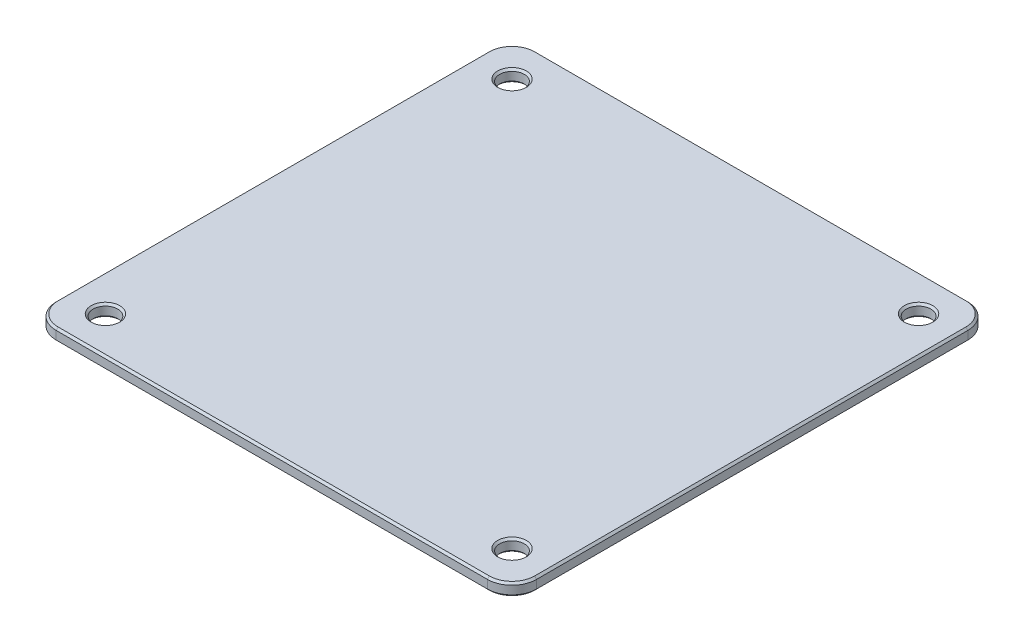
ISO-10303-21;
HEADER;
FILE_DESCRIPTION(('STEP AP214'),'2;1');
FILE_NAME('part.step','',(''),(''),'','','');
FILE_SCHEMA(('AUTOMOTIVE_DESIGN { 1 0 10303 214 1 1 1 1 }'));
ENDSEC;
DATA;
#1=APPLICATION_CONTEXT('core data for automotive mechanical design processes');
#2=APPLICATION_PROTOCOL_DEFINITION('international standard','automotive_design',2000,#1);
#3=PRODUCT_CONTEXT('',#1,'mechanical');
#4=PRODUCT('Part','Part','',(#3));
#5=PRODUCT_RELATED_PRODUCT_CATEGORY('part','',(#4));
#6=PRODUCT_DEFINITION_FORMATION('','',#4);
#7=PRODUCT_DEFINITION_CONTEXT('part definition',#1,'design');
#8=PRODUCT_DEFINITION('design','',#6,#7);
#9=PRODUCT_DEFINITION_SHAPE('','',#8);
#10=(LENGTH_UNIT() NAMED_UNIT(*) SI_UNIT(.MILLI.,.METRE.));
#11=(NAMED_UNIT(*) PLANE_ANGLE_UNIT() SI_UNIT($,.RADIAN.));
#12=(NAMED_UNIT(*) SI_UNIT($,.STERADIAN.) SOLID_ANGLE_UNIT());
#13=UNCERTAINTY_MEASURE_WITH_UNIT(LENGTH_MEASURE(1.E-05),#10,'distance_accuracy_value','');
#14=(GEOMETRIC_REPRESENTATION_CONTEXT(3) GLOBAL_UNCERTAINTY_ASSIGNED_CONTEXT((#13)) GLOBAL_UNIT_ASSIGNED_CONTEXT((#10,
#11,#12)) REPRESENTATION_CONTEXT('',''));
#15=CARTESIAN_POINT('',(0.,0.,0.));
#16=DIRECTION('',(0.,0.,1.));
#17=DIRECTION('',(1.,0.,0.));
#18=AXIS2_PLACEMENT_3D('',#15,#16,#17);
#19=CARTESIAN_POINT('',(0.,1.5875,0.));
#20=DIRECTION('',(0.,-1.,0.));
#21=DIRECTION('',(0.,0.,-1.));
#22=AXIS2_PLACEMENT_3D('',#19,#20,#21);
#23=PLANE('',#22);
#24=CARTESIAN_POINT('',(-26.19375,1.5875,26.19375));
#25=DIRECTION('',(0.,-1.,0.));
#26=DIRECTION('',(0.,0.,-1.));
#27=AXIS2_PLACEMENT_3D('',#24,#25,#26);
#28=CIRCLE('',#27,1.84149999999998);
#29=CARTESIAN_POINT('',(-26.19375,1.5875,24.35225));
#30=VERTEX_POINT('',#29);
#31=EDGE_CURVE('E11',#30,#30,#28,.T.);
#32=ORIENTED_EDGE('',*,*,#31,.T.);
#33=EDGE_LOOP('',(#32));
#34=FACE_BOUND('',#33,.T.);
#35=CARTESIAN_POINT('',(26.19375,1.5875,26.19375));
#36=DIRECTION('',(0.,-1.,0.));
#37=DIRECTION('',(0.,0.,-1.));
#38=AXIS2_PLACEMENT_3D('',#35,#36,#37);
#39=CIRCLE('',#38,1.84149999999998);
#40=CARTESIAN_POINT('',(26.19375,1.5875,24.35225));
#41=VERTEX_POINT('',#40);
#42=EDGE_CURVE('E41',#41,#41,#39,.T.);
#43=ORIENTED_EDGE('',*,*,#42,.T.);
#44=EDGE_LOOP('',(#43));
#45=FACE_BOUND('',#44,.T.);
#46=CARTESIAN_POINT('',(26.19375,1.5875,-26.19375));
#47=DIRECTION('',(0.,-1.,0.));
#48=DIRECTION('',(0.,0.,-1.));
#49=AXIS2_PLACEMENT_3D('',#46,#47,#48);
#50=CIRCLE('',#49,1.84150000000001);
#51=CARTESIAN_POINT('',(26.19375,1.5875,-28.03525));
#52=VERTEX_POINT('',#51);
#53=EDGE_CURVE('E258',#52,#52,#50,.T.);
#54=ORIENTED_EDGE('',*,*,#53,.T.);
#55=EDGE_LOOP('',(#54));
#56=FACE_BOUND('',#55,.T.);
#57=CARTESIAN_POINT('',(-26.19375,1.5875,-26.19375));
#58=DIRECTION('',(0.,-1.,0.));
#59=DIRECTION('',(0.,0.,-1.));
#60=AXIS2_PLACEMENT_3D('',#57,#58,#59);
#61=CIRCLE('',#60,1.84149999999998);
#62=CARTESIAN_POINT('',(-26.19375,1.5875,-28.03525));
#63=VERTEX_POINT('',#62);
#64=EDGE_CURVE('E255',#63,#63,#61,.T.);
#65=ORIENTED_EDGE('',*,*,#64,.T.);
#66=EDGE_LOOP('',(#65));
#67=FACE_BOUND('',#66,.T.);
#68=DIRECTION('',(0.,0.,1.));
#69=VECTOR('',#68,1.);
#70=CARTESIAN_POINT('',(-30.70225,1.5875,0.));
#71=LINE('',#70,#69);
#72=CARTESIAN_POINT('',(-30.70225,1.5875,-27.78125));
#73=VERTEX_POINT('',#72);
#74=CARTESIAN_POINT('',(-30.70225,1.5875,27.78125));
#75=VERTEX_POINT('',#74);
#76=EDGE_CURVE('E49',#73,#75,#71,.T.);
#77=ORIENTED_EDGE('',*,*,#76,.T.);
#78=CARTESIAN_POINT('',(-27.78125,1.5875,27.78125));
#79=DIRECTION('',(0.,-1.,0.));
#80=DIRECTION('',(0.,0.,-1.));
#81=AXIS2_PLACEMENT_3D('',#78,#79,#80);
#82=CIRCLE('',#81,2.92100000000001);
#83=CARTESIAN_POINT('',(-27.78125,1.5875,30.70225));
#84=VERTEX_POINT('',#83);
#85=EDGE_CURVE('E253',#75,#84,#82,.F.);
#86=ORIENTED_EDGE('',*,*,#85,.T.);
#87=DIRECTION('',(1.,0.,0.));
#88=VECTOR('',#87,1.);
#89=CARTESIAN_POINT('',(0.,1.5875,30.70225));
#90=LINE('',#89,#88);
#91=CARTESIAN_POINT('',(27.78125,1.5875,30.70225));
#92=VERTEX_POINT('',#91);
#93=EDGE_CURVE('E241',#84,#92,#90,.T.);
#94=ORIENTED_EDGE('',*,*,#93,.T.);
#95=CARTESIAN_POINT('',(27.78125,1.5875,27.78125));
#96=DIRECTION('',(0.,-1.,0.));
#97=DIRECTION('',(0.,0.,-1.));
#98=AXIS2_PLACEMENT_3D('',#95,#96,#97);
#99=CIRCLE('',#98,2.92100000000001);
#100=CARTESIAN_POINT('',(30.70225,1.5875,27.78125));
#101=VERTEX_POINT('',#100);
#102=EDGE_CURVE('E243',#92,#101,#99,.F.);
#103=ORIENTED_EDGE('',*,*,#102,.T.);
#104=DIRECTION('',(0.,0.,-1.));
#105=VECTOR('',#104,1.);
#106=CARTESIAN_POINT('',(30.70225,1.5875,0.));
#107=LINE('',#106,#105);
#108=CARTESIAN_POINT('',(30.70225,1.5875,-27.78125));
#109=VERTEX_POINT('',#108);
#110=EDGE_CURVE('E245',#101,#109,#107,.T.);
#111=ORIENTED_EDGE('',*,*,#110,.T.);
#112=CARTESIAN_POINT('',(27.78125,1.5875,-27.78125));
#113=DIRECTION('',(0.,-1.,0.));
#114=DIRECTION('',(0.,0.,-1.));
#115=AXIS2_PLACEMENT_3D('',#112,#113,#114);
#116=CIRCLE('',#115,2.92100000000001);
#117=CARTESIAN_POINT('',(27.78125,1.5875,-30.70225));
#118=VERTEX_POINT('',#117);
#119=EDGE_CURVE('E247',#109,#118,#116,.F.);
#120=ORIENTED_EDGE('',*,*,#119,.T.);
#121=DIRECTION('',(-1.,0.,0.));
#122=VECTOR('',#121,1.);
#123=CARTESIAN_POINT('',(0.,1.5875,-30.70225));
#124=LINE('',#123,#122);
#125=CARTESIAN_POINT('',(-27.78125,1.5875,-30.70225));
#126=VERTEX_POINT('',#125);
#127=EDGE_CURVE('E249',#118,#126,#124,.T.);
#128=ORIENTED_EDGE('',*,*,#127,.T.);
#129=CARTESIAN_POINT('',(-27.78125,1.5875,-27.78125));
#130=DIRECTION('',(0.,-1.,0.));
#131=DIRECTION('',(0.,0.,-1.));
#132=AXIS2_PLACEMENT_3D('',#129,#130,#131);
#133=CIRCLE('',#132,2.92100000000001);
#134=EDGE_CURVE('E54',#126,#73,#133,.F.);
#135=ORIENTED_EDGE('',*,*,#134,.T.);
#136=EDGE_LOOP('',(#77,#86,#94,#103,#111,#120,#128,#135));
#137=FACE_BOUND('',#136,.T.);
#138=ADVANCED_FACE('F32',(#34,#45,#56,#67,#137),#23,.F.);
#139=CARTESIAN_POINT('',(0.,0.,0.));
#140=DIRECTION('',(0.,-1.,0.));
#141=DIRECTION('',(0.,0.,-1.));
#142=AXIS2_PLACEMENT_3D('',#139,#140,#141);
#143=PLANE('',#142);
#144=CARTESIAN_POINT('',(-26.19375,0.,26.19375));
#145=DIRECTION('',(0.,-1.,0.));
#146=DIRECTION('',(0.,0.,-1.));
#147=AXIS2_PLACEMENT_3D('',#144,#145,#146);
#148=CIRCLE('',#147,1.8415);
#149=CARTESIAN_POINT('',(-26.19375,0.,24.35225));
#150=VERTEX_POINT('',#149);
#151=EDGE_CURVE('E177',#150,#150,#148,.F.);
#152=ORIENTED_EDGE('',*,*,#151,.T.);
#153=EDGE_LOOP('',(#152));
#154=FACE_BOUND('',#153,.T.);
#155=CARTESIAN_POINT('',(26.19375,0.,-26.19375));
#156=DIRECTION('',(0.,-1.,0.));
#157=DIRECTION('',(0.,0.,-1.));
#158=AXIS2_PLACEMENT_3D('',#155,#156,#157);
#159=CIRCLE('',#158,1.8415);
#160=CARTESIAN_POINT('',(26.19375,0.,-28.03525));
#161=VERTEX_POINT('',#160);
#162=EDGE_CURVE('E174',#161,#161,#159,.F.);
#163=ORIENTED_EDGE('',*,*,#162,.T.);
#164=EDGE_LOOP('',(#163));
#165=FACE_BOUND('',#164,.T.);
#166=DIRECTION('',(1.,0.,0.));
#167=VECTOR('',#166,1.);
#168=CARTESIAN_POINT('',(27.78125,0.,-30.70225));
#169=LINE('',#168,#167);
#170=CARTESIAN_POINT('',(-27.78125,0.,-30.70225));
#171=VERTEX_POINT('',#170);
#172=CARTESIAN_POINT('',(27.78125,0.,-30.70225));
#173=VERTEX_POINT('',#172);
#174=EDGE_CURVE('E172',#171,#173,#169,.T.);
#175=ORIENTED_EDGE('',*,*,#174,.T.);
#176=CARTESIAN_POINT('',(27.78125,0.,-27.78125));
#177=DIRECTION('',(0.,-1.,0.));
#178=DIRECTION('',(0.,0.,-1.));
#179=AXIS2_PLACEMENT_3D('',#176,#177,#178);
#180=CIRCLE('',#179,2.921);
#181=CARTESIAN_POINT('',(30.70225,0.,-27.78125));
#182=VERTEX_POINT('',#181);
#183=EDGE_CURVE('E152',#173,#182,#180,.T.);
#184=ORIENTED_EDGE('',*,*,#183,.T.);
#185=DIRECTION('',(0.,0.,1.));
#186=VECTOR('',#185,1.);
#187=CARTESIAN_POINT('',(30.70225,0.,27.78125));
#188=LINE('',#187,#186);
#189=CARTESIAN_POINT('',(30.70225,0.,27.78125));
#190=VERTEX_POINT('',#189);
#191=EDGE_CURVE('E160',#182,#190,#188,.T.);
#192=ORIENTED_EDGE('',*,*,#191,.T.);
#193=CARTESIAN_POINT('',(27.78125,0.,27.78125));
#194=DIRECTION('',(0.,-1.,0.));
#195=DIRECTION('',(0.,0.,-1.));
#196=AXIS2_PLACEMENT_3D('',#193,#194,#195);
#197=CIRCLE('',#196,2.921);
#198=CARTESIAN_POINT('',(27.78125,0.,30.70225));
#199=VERTEX_POINT('',#198);
#200=EDGE_CURVE('E166',#190,#199,#197,.T.);
#201=ORIENTED_EDGE('',*,*,#200,.T.);
#202=DIRECTION('',(-1.,0.,0.));
#203=VECTOR('',#202,1.);
#204=CARTESIAN_POINT('',(-27.78125,0.,30.70225));
#205=LINE('',#204,#203);
#206=CARTESIAN_POINT('',(-27.78125,0.,30.70225));
#207=VERTEX_POINT('',#206);
#208=EDGE_CURVE('E349',#199,#207,#205,.T.);
#209=ORIENTED_EDGE('',*,*,#208,.T.);
#210=CARTESIAN_POINT('',(-27.78125,0.,27.78125));
#211=DIRECTION('',(0.,-1.,0.));
#212=DIRECTION('',(0.,0.,-1.));
#213=AXIS2_PLACEMENT_3D('',#210,#211,#212);
#214=CIRCLE('',#213,2.921);
#215=CARTESIAN_POINT('',(-30.70225,0.,27.78125));
#216=VERTEX_POINT('',#215);
#217=EDGE_CURVE('E351',#207,#216,#214,.T.);
#218=ORIENTED_EDGE('',*,*,#217,.T.);
#219=DIRECTION('',(0.,0.,-1.));
#220=VECTOR('',#219,1.);
#221=CARTESIAN_POINT('',(-30.70225,0.,-27.78125));
#222=LINE('',#221,#220);
#223=CARTESIAN_POINT('',(-30.70225,0.,-27.78125));
#224=VERTEX_POINT('',#223);
#225=EDGE_CURVE('E353',#216,#224,#222,.T.);
#226=ORIENTED_EDGE('',*,*,#225,.T.);
#227=CARTESIAN_POINT('',(-27.78125,0.,-27.78125));
#228=DIRECTION('',(0.,-1.,0.));
#229=DIRECTION('',(0.,0.,-1.));
#230=AXIS2_PLACEMENT_3D('',#227,#228,#229);
#231=CIRCLE('',#230,2.921);
#232=EDGE_CURVE('E179',#224,#171,#231,.T.);
#233=ORIENTED_EDGE('',*,*,#232,.T.);
#234=EDGE_LOOP('',(#175,#184,#192,#201,#209,#218,#226,#233));
#235=FACE_BOUND('',#234,.T.);
#236=CARTESIAN_POINT('',(-26.19375,0.,-26.19375));
#237=DIRECTION('',(0.,-1.,0.));
#238=DIRECTION('',(0.,0.,-1.));
#239=AXIS2_PLACEMENT_3D('',#236,#237,#238);
#240=CIRCLE('',#239,1.84149999999998);
#241=CARTESIAN_POINT('',(-26.19375,0.,-28.03525));
#242=VERTEX_POINT('',#241);
#243=EDGE_CURVE('E167',#242,#242,#240,.F.);
#244=ORIENTED_EDGE('',*,*,#243,.T.);
#245=EDGE_LOOP('',(#244));
#246=FACE_BOUND('',#245,.T.);
#247=CARTESIAN_POINT('',(26.19375,0.,26.19375));
#248=DIRECTION('',(0.,-1.,0.));
#249=DIRECTION('',(0.,0.,-1.));
#250=AXIS2_PLACEMENT_3D('',#247,#248,#249);
#251=CIRCLE('',#250,1.8415);
#252=CARTESIAN_POINT('',(26.19375,0.,24.35225));
#253=VERTEX_POINT('',#252);
#254=EDGE_CURVE('E343',#253,#253,#251,.F.);
#255=ORIENTED_EDGE('',*,*,#254,.T.);
#256=EDGE_LOOP('',(#255));
#257=FACE_BOUND('',#256,.T.);
#258=ADVANCED_FACE('F169',(#154,#165,#235,#246,#257),#143,.T.);
#259=CARTESIAN_POINT('',(30.95625,1.5875,30.95625));
#260=DIRECTION('',(-1.,0.,0.));
#261=DIRECTION('',(0.,0.,1.));
#262=AXIS2_PLACEMENT_3D('',#259,#260,#261);
#263=PLANE('',#262);
#264=DIRECTION('',(0.,-1.,0.));
#265=VECTOR('',#264,1.);
#266=CARTESIAN_POINT('',(30.95625,1.5875,27.78125));
#267=LINE('',#266,#265);
#268=CARTESIAN_POINT('',(30.95625,1.33350000000001,27.78125));
#269=VERTEX_POINT('',#268);
#270=CARTESIAN_POINT('',(30.95625,0.254000000000004,27.78125));
#271=VERTEX_POINT('',#270);
#272=EDGE_CURVE('E323',#269,#271,#267,.T.);
#273=ORIENTED_EDGE('',*,*,#272,.T.);
#274=DIRECTION('',(0.,0.,-1.));
#275=VECTOR('',#274,1.);
#276=CARTESIAN_POINT('',(30.95625,0.254000000000004,-27.78125));
#277=LINE('',#276,#275);
#278=CARTESIAN_POINT('',(30.95625,0.254000000000004,-27.78125));
#279=VERTEX_POINT('',#278);
#280=EDGE_CURVE('E227',#271,#279,#277,.T.);
#281=ORIENTED_EDGE('',*,*,#280,.T.);
#282=DIRECTION('',(0.,-1.,0.));
#283=VECTOR('',#282,1.);
#284=CARTESIAN_POINT('',(30.95625,1.5875,-27.78125));
#285=LINE('',#284,#283);
#286=CARTESIAN_POINT('',(30.95625,1.33350000000001,-27.78125));
#287=VERTEX_POINT('',#286);
#288=EDGE_CURVE('E280',#279,#287,#285,.F.);
#289=ORIENTED_EDGE('',*,*,#288,.T.);
#290=DIRECTION('',(0.,0.,1.));
#291=VECTOR('',#290,1.);
#292=CARTESIAN_POINT('',(30.95625,1.33350000000001,30.95625));
#293=LINE('',#292,#291);
#294=EDGE_CURVE('E225',#287,#269,#293,.T.);
#295=ORIENTED_EDGE('',*,*,#294,.T.);
#296=EDGE_LOOP('',(#273,#281,#289,#295));
#297=FACE_BOUND('',#296,.T.);
#298=ADVANCED_FACE('F321',(#297),#263,.F.);
#299=CARTESIAN_POINT('',(-30.95625,1.5875,-30.95625));
#300=DIRECTION('',(0.,0.,1.));
#301=DIRECTION('',(1.,0.,0.));
#302=AXIS2_PLACEMENT_3D('',#299,#300,#301);
#303=PLANE('',#302);
#304=DIRECTION('',(0.,-1.,0.));
#305=VECTOR('',#304,1.);
#306=CARTESIAN_POINT('',(27.78125,1.5875,-30.95625));
#307=LINE('',#306,#305);
#308=CARTESIAN_POINT('',(27.78125,1.33350000000001,-30.95625));
#309=VERTEX_POINT('',#308);
#310=CARTESIAN_POINT('',(27.78125,0.254000000000004,-30.95625));
#311=VERTEX_POINT('',#310);
#312=EDGE_CURVE('E318',#309,#311,#307,.T.);
#313=ORIENTED_EDGE('',*,*,#312,.T.);
#314=DIRECTION('',(-1.,0.,0.));
#315=VECTOR('',#314,1.);
#316=CARTESIAN_POINT('',(-27.78125,0.254000000000004,-30.95625));
#317=LINE('',#316,#315);
#318=CARTESIAN_POINT('',(-27.78125,0.254000000000004,-30.95625));
#319=VERTEX_POINT('',#318);
#320=EDGE_CURVE('E202',#311,#319,#317,.T.);
#321=ORIENTED_EDGE('',*,*,#320,.T.);
#322=DIRECTION('',(0.,-1.,0.));
#323=VECTOR('',#322,1.);
#324=CARTESIAN_POINT('',(-27.78125,1.5875,-30.95625));
#325=LINE('',#324,#323);
#326=CARTESIAN_POINT('',(-27.78125,1.33350000000001,-30.95625));
#327=VERTEX_POINT('',#326);
#328=EDGE_CURVE('E340',#319,#327,#325,.F.);
#329=ORIENTED_EDGE('',*,*,#328,.T.);
#330=DIRECTION('',(1.,0.,0.));
#331=VECTOR('',#330,1.);
#332=CARTESIAN_POINT('',(-30.95625,1.33350000000001,-30.95625));
#333=LINE('',#332,#331);
#334=EDGE_CURVE('E200',#327,#309,#333,.T.);
#335=ORIENTED_EDGE('',*,*,#334,.T.);
#336=EDGE_LOOP('',(#313,#321,#329,#335));
#337=FACE_BOUND('',#336,.T.);
#338=ADVANCED_FACE('F366',(#337),#303,.F.);
#339=CARTESIAN_POINT('',(-30.95625,1.5875,30.95625));
#340=DIRECTION('',(1.,0.,0.));
#341=DIRECTION('',(0.,0.,-1.));
#342=AXIS2_PLACEMENT_3D('',#339,#340,#341);
#343=PLANE('',#342);
#344=DIRECTION('',(0.,-1.,0.));
#345=VECTOR('',#344,1.);
#346=CARTESIAN_POINT('',(-30.95625,1.5875,-27.78125));
#347=LINE('',#346,#345);
#348=CARTESIAN_POINT('',(-30.95625,1.33350000000001,-27.78125));
#349=VERTEX_POINT('',#348);
#350=CARTESIAN_POINT('',(-30.95625,0.254000000000004,-27.78125));
#351=VERTEX_POINT('',#350);
#352=EDGE_CURVE('E336',#349,#351,#347,.T.);
#353=ORIENTED_EDGE('',*,*,#352,.T.);
#354=DIRECTION('',(0.,0.,1.));
#355=VECTOR('',#354,1.);
#356=CARTESIAN_POINT('',(-30.95625,0.254000000000004,27.78125));
#357=LINE('',#356,#355);
#358=CARTESIAN_POINT('',(-30.95625,0.254000000000004,27.78125));
#359=VERTEX_POINT('',#358);
#360=EDGE_CURVE('E210',#351,#359,#357,.T.);
#361=ORIENTED_EDGE('',*,*,#360,.T.);
#362=DIRECTION('',(0.,-1.,0.));
#363=VECTOR('',#362,1.);
#364=CARTESIAN_POINT('',(-30.95625,1.5875,27.78125));
#365=LINE('',#364,#363);
#366=CARTESIAN_POINT('',(-30.95625,1.33350000000001,27.78125));
#367=VERTEX_POINT('',#366);
#368=EDGE_CURVE('E333',#359,#367,#365,.F.);
#369=ORIENTED_EDGE('',*,*,#368,.T.);
#370=DIRECTION('',(0.,0.,-1.));
#371=VECTOR('',#370,1.);
#372=CARTESIAN_POINT('',(-30.95625,1.33350000000001,30.95625));
#373=LINE('',#372,#371);
#374=EDGE_CURVE('E208',#367,#349,#373,.T.);
#375=ORIENTED_EDGE('',*,*,#374,.T.);
#376=EDGE_LOOP('',(#353,#361,#369,#375));
#377=FACE_BOUND('',#376,.T.);
#378=ADVANCED_FACE('F409',(#377),#343,.F.);
#379=CARTESIAN_POINT('',(-30.95625,1.5875,30.95625));
#380=DIRECTION('',(0.,0.,-1.));
#381=DIRECTION('',(-1.,0.,0.));
#382=AXIS2_PLACEMENT_3D('',#379,#380,#381);
#383=PLANE('',#382);
#384=DIRECTION('',(0.,-1.,0.));
#385=VECTOR('',#384,1.);
#386=CARTESIAN_POINT('',(-27.78125,1.5875,30.95625));
#387=LINE('',#386,#385);
#388=CARTESIAN_POINT('',(-27.78125,1.33350000000001,30.95625));
#389=VERTEX_POINT('',#388);
#390=CARTESIAN_POINT('',(-27.78125,0.254000000000004,30.95625));
#391=VERTEX_POINT('',#390);
#392=EDGE_CURVE('E325',#389,#391,#387,.T.);
#393=ORIENTED_EDGE('',*,*,#392,.T.);
#394=DIRECTION('',(1.,0.,0.));
#395=VECTOR('',#394,1.);
#396=CARTESIAN_POINT('',(27.78125,0.254000000000004,30.95625));
#397=LINE('',#396,#395);
#398=CARTESIAN_POINT('',(27.78125,0.254000000000004,30.95625));
#399=VERTEX_POINT('',#398);
#400=EDGE_CURVE('E219',#391,#399,#397,.T.);
#401=ORIENTED_EDGE('',*,*,#400,.T.);
#402=DIRECTION('',(0.,-1.,0.));
#403=VECTOR('',#402,1.);
#404=CARTESIAN_POINT('',(27.78125,1.5875,30.95625));
#405=LINE('',#404,#403);
#406=CARTESIAN_POINT('',(27.78125,1.33350000000001,30.95625));
#407=VERTEX_POINT('',#406);
#408=EDGE_CURVE('E330',#399,#407,#405,.F.);
#409=ORIENTED_EDGE('',*,*,#408,.T.);
#410=DIRECTION('',(-1.,0.,0.));
#411=VECTOR('',#410,1.);
#412=CARTESIAN_POINT('',(-30.95625,1.33350000000001,30.95625));
#413=LINE('',#412,#411);
#414=EDGE_CURVE('E217',#407,#389,#413,.T.);
#415=ORIENTED_EDGE('',*,*,#414,.T.);
#416=EDGE_LOOP('',(#393,#401,#409,#415));
#417=FACE_BOUND('',#416,.T.);
#418=ADVANCED_FACE('F393',(#417),#383,.F.);
#419=CARTESIAN_POINT('',(-26.19375,1.5875,-26.19375));
#420=DIRECTION('',(0.,-1.,0.));
#421=DIRECTION('',(0.,0.,-1.));
#422=AXIS2_PLACEMENT_3D('',#419,#420,#421);
#423=CYLINDRICAL_SURFACE('',#422,1.5875);
#424=CARTESIAN_POINT('',(-26.19375,0.253999999999982,-26.19375));
#425=DIRECTION('',(0.,-1.,0.));
#426=DIRECTION('',(0.,0.,-1.));
#427=AXIS2_PLACEMENT_3D('',#424,#425,#426);
#428=CIRCLE('',#427,1.5875);
#429=CARTESIAN_POINT('',(-26.19375,0.253999999999982,-27.78125));
#430=VERTEX_POINT('',#429);
#431=EDGE_CURVE('E232',#430,#430,#428,.T.);
#432=ORIENTED_EDGE('',*,*,#431,.T.);
#433=EDGE_LOOP('',(#432));
#434=FACE_BOUND('',#433,.T.);
#435=CARTESIAN_POINT('',(-26.19375,1.3335,-26.19375));
#436=DIRECTION('',(0.,-1.,0.));
#437=DIRECTION('',(0.,0.,-1.));
#438=AXIS2_PLACEMENT_3D('',#435,#436,#437);
#439=CIRCLE('',#438,1.5875);
#440=CARTESIAN_POINT('',(-26.19375,1.3335,-27.78125));
#441=VERTEX_POINT('',#440);
#442=EDGE_CURVE('E229',#441,#441,#439,.F.);
#443=ORIENTED_EDGE('',*,*,#442,.T.);
#444=EDGE_LOOP('',(#443));
#445=FACE_BOUND('',#444,.T.);
#446=ADVANCED_FACE('F416',(#434,#445),#423,.F.);
#447=CARTESIAN_POINT('',(26.19375,1.5875,-26.19375));
#448=DIRECTION('',(0.,-1.,0.));
#449=DIRECTION('',(0.,0.,-1.));
#450=AXIS2_PLACEMENT_3D('',#447,#448,#449);
#451=CYLINDRICAL_SURFACE('',#450,1.5875);
#452=CARTESIAN_POINT('',(26.19375,0.253999999999996,-26.19375));
#453=DIRECTION('',(0.,-1.,0.));
#454=DIRECTION('',(0.,0.,-1.));
#455=AXIS2_PLACEMENT_3D('',#452,#453,#454);
#456=CIRCLE('',#455,1.5875);
#457=CARTESIAN_POINT('',(26.19375,0.253999999999996,-27.78125));
#458=VERTEX_POINT('',#457);
#459=EDGE_CURVE('E194',#458,#458,#456,.T.);
#460=ORIENTED_EDGE('',*,*,#459,.T.);
#461=EDGE_LOOP('',(#460));
#462=FACE_BOUND('',#461,.T.);
#463=CARTESIAN_POINT('',(26.19375,1.33349999999999,-26.19375));
#464=DIRECTION('',(0.,-1.,0.));
#465=DIRECTION('',(0.,0.,-1.));
#466=AXIS2_PLACEMENT_3D('',#463,#464,#465);
#467=CIRCLE('',#466,1.5875);
#468=CARTESIAN_POINT('',(26.19375,1.33349999999999,-27.78125));
#469=VERTEX_POINT('',#468);
#470=EDGE_CURVE('E191',#469,#469,#467,.F.);
#471=ORIENTED_EDGE('',*,*,#470,.T.);
#472=EDGE_LOOP('',(#471));
#473=FACE_BOUND('',#472,.T.);
#474=ADVANCED_FACE('F431',(#462,#473),#451,.F.);
#475=CARTESIAN_POINT('',(26.19375,1.5875,26.19375));
#476=DIRECTION('',(0.,-1.,0.));
#477=DIRECTION('',(0.,0.,-1.));
#478=AXIS2_PLACEMENT_3D('',#475,#476,#477);
#479=CYLINDRICAL_SURFACE('',#478,1.5875);
#480=CARTESIAN_POINT('',(26.19375,0.253999999999996,26.19375));
#481=DIRECTION('',(0.,-1.,0.));
#482=DIRECTION('',(0.,0.,-1.));
#483=AXIS2_PLACEMENT_3D('',#480,#481,#482);
#484=CIRCLE('',#483,1.5875);
#485=CARTESIAN_POINT('',(26.19375,0.253999999999996,24.60625));
#486=VERTEX_POINT('',#485);
#487=EDGE_CURVE('E238',#486,#486,#484,.T.);
#488=ORIENTED_EDGE('',*,*,#487,.T.);
#489=EDGE_LOOP('',(#488));
#490=FACE_BOUND('',#489,.T.);
#491=CARTESIAN_POINT('',(26.19375,1.3335,26.19375));
#492=DIRECTION('',(0.,-1.,0.));
#493=DIRECTION('',(0.,0.,-1.));
#494=AXIS2_PLACEMENT_3D('',#491,#492,#493);
#495=CIRCLE('',#494,1.5875);
#496=CARTESIAN_POINT('',(26.19375,1.3335,24.60625));
#497=VERTEX_POINT('',#496);
#498=EDGE_CURVE('E235',#497,#497,#495,.F.);
#499=ORIENTED_EDGE('',*,*,#498,.T.);
#500=EDGE_LOOP('',(#499));
#501=FACE_BOUND('',#500,.T.);
#502=ADVANCED_FACE('F435',(#490,#501),#479,.F.);
#503=CARTESIAN_POINT('',(-26.19375,1.5875,26.19375));
#504=DIRECTION('',(0.,-1.,0.));
#505=DIRECTION('',(0.,0.,-1.));
#506=AXIS2_PLACEMENT_3D('',#503,#504,#505);
#507=CYLINDRICAL_SURFACE('',#506,1.5875);
#508=CARTESIAN_POINT('',(-26.19375,0.253999999999996,26.19375));
#509=DIRECTION('',(0.,-1.,0.));
#510=DIRECTION('',(0.,0.,-1.));
#511=AXIS2_PLACEMENT_3D('',#508,#509,#510);
#512=CIRCLE('',#511,1.5875);
#513=CARTESIAN_POINT('',(-26.19375,0.253999999999996,24.60625));
#514=VERTEX_POINT('',#513);
#515=EDGE_CURVE('E188',#514,#514,#512,.T.);
#516=ORIENTED_EDGE('',*,*,#515,.T.);
#517=EDGE_LOOP('',(#516));
#518=FACE_BOUND('',#517,.T.);
#519=CARTESIAN_POINT('',(-26.19375,1.3335,26.19375));
#520=DIRECTION('',(0.,-1.,0.));
#521=DIRECTION('',(0.,0.,-1.));
#522=AXIS2_PLACEMENT_3D('',#519,#520,#521);
#523=CIRCLE('',#522,1.5875);
#524=CARTESIAN_POINT('',(-26.19375,1.3335,24.60625));
#525=VERTEX_POINT('',#524);
#526=EDGE_CURVE('E185',#525,#525,#523,.F.);
#527=ORIENTED_EDGE('',*,*,#526,.T.);
#528=EDGE_LOOP('',(#527));
#529=FACE_BOUND('',#528,.T.);
#530=ADVANCED_FACE('F439',(#518,#529),#507,.F.);
#531=CARTESIAN_POINT('',(27.78125,1.5875,27.78125));
#532=DIRECTION('',(0.,-1.,0.));
#533=DIRECTION('',(0.,0.,-1.));
#534=AXIS2_PLACEMENT_3D('',#531,#532,#533);
#535=CYLINDRICAL_SURFACE('',#534,3.175);
#536=ORIENTED_EDGE('',*,*,#408,.F.);
#537=CARTESIAN_POINT('',(27.78125,0.254000000000004,27.78125));
#538=DIRECTION('',(0.,-1.,0.));
#539=DIRECTION('',(0.,0.,-1.));
#540=AXIS2_PLACEMENT_3D('',#537,#538,#539);
#541=CIRCLE('',#540,3.175);
#542=EDGE_CURVE('E223',#399,#271,#541,.F.);
#543=ORIENTED_EDGE('',*,*,#542,.T.);
#544=ORIENTED_EDGE('',*,*,#272,.F.);
#545=CARTESIAN_POINT('',(27.78125,1.33350000000001,27.78125));
#546=DIRECTION('',(0.,-1.,0.));
#547=DIRECTION('',(0.,0.,-1.));
#548=AXIS2_PLACEMENT_3D('',#545,#546,#547);
#549=CIRCLE('',#548,3.175);
#550=EDGE_CURVE('E221',#269,#407,#549,.T.);
#551=ORIENTED_EDGE('',*,*,#550,.T.);
#552=EDGE_LOOP('',(#536,#543,#544,#551));
#553=FACE_BOUND('',#552,.T.);
#554=ADVANCED_FACE('F442',(#553),#535,.T.);
#555=CARTESIAN_POINT('',(-27.78125,1.5875,-27.78125));
#556=DIRECTION('',(0.,-1.,0.));
#557=DIRECTION('',(0.,0.,-1.));
#558=AXIS2_PLACEMENT_3D('',#555,#556,#557);
#559=CYLINDRICAL_SURFACE('',#558,3.175);
#560=ORIENTED_EDGE('',*,*,#328,.F.);
#561=CARTESIAN_POINT('',(-27.78125,0.254000000000004,-27.78125));
#562=DIRECTION('',(0.,-1.,0.));
#563=DIRECTION('',(0.,0.,-1.));
#564=AXIS2_PLACEMENT_3D('',#561,#562,#563);
#565=CIRCLE('',#564,3.175);
#566=EDGE_CURVE('E206',#319,#351,#565,.F.);
#567=ORIENTED_EDGE('',*,*,#566,.T.);
#568=ORIENTED_EDGE('',*,*,#352,.F.);
#569=CARTESIAN_POINT('',(-27.78125,1.33350000000001,-27.78125));
#570=DIRECTION('',(0.,-1.,0.));
#571=DIRECTION('',(0.,0.,-1.));
#572=AXIS2_PLACEMENT_3D('',#569,#570,#571);
#573=CIRCLE('',#572,3.175);
#574=EDGE_CURVE('E204',#349,#327,#573,.T.);
#575=ORIENTED_EDGE('',*,*,#574,.T.);
#576=EDGE_LOOP('',(#560,#567,#568,#575));
#577=FACE_BOUND('',#576,.T.);
#578=ADVANCED_FACE('F368',(#577),#559,.T.);
#579=CARTESIAN_POINT('',(27.78125,1.5875,-27.78125));
#580=DIRECTION('',(0.,-1.,0.));
#581=DIRECTION('',(0.,0.,-1.));
#582=AXIS2_PLACEMENT_3D('',#579,#580,#581);
#583=CYLINDRICAL_SURFACE('',#582,3.175);
#584=ORIENTED_EDGE('',*,*,#288,.F.);
#585=CARTESIAN_POINT('',(27.78125,0.254000000000004,-27.78125));
#586=DIRECTION('',(0.,-1.,0.));
#587=DIRECTION('',(0.,0.,-1.));
#588=AXIS2_PLACEMENT_3D('',#585,#586,#587);
#589=CIRCLE('',#588,3.175);
#590=EDGE_CURVE('E154',#279,#311,#589,.F.);
#591=ORIENTED_EDGE('',*,*,#590,.T.);
#592=ORIENTED_EDGE('',*,*,#312,.F.);
#593=CARTESIAN_POINT('',(27.78125,1.33350000000001,-27.78125));
#594=DIRECTION('',(0.,-1.,0.));
#595=DIRECTION('',(0.,0.,-1.));
#596=AXIS2_PLACEMENT_3D('',#593,#594,#595);
#597=CIRCLE('',#596,3.175);
#598=EDGE_CURVE('E197',#309,#287,#597,.T.);
#599=ORIENTED_EDGE('',*,*,#598,.T.);
#600=EDGE_LOOP('',(#584,#591,#592,#599));
#601=FACE_BOUND('',#600,.T.);
#602=ADVANCED_FACE('F316',(#601),#583,.T.);
#603=CARTESIAN_POINT('',(-27.78125,1.5875,27.78125));
#604=DIRECTION('',(0.,-1.,0.));
#605=DIRECTION('',(0.,0.,-1.));
#606=AXIS2_PLACEMENT_3D('',#603,#604,#605);
#607=CYLINDRICAL_SURFACE('',#606,3.175);
#608=ORIENTED_EDGE('',*,*,#368,.F.);
#609=CARTESIAN_POINT('',(-27.78125,0.254000000000004,27.78125));
#610=DIRECTION('',(0.,-1.,0.));
#611=DIRECTION('',(0.,0.,-1.));
#612=AXIS2_PLACEMENT_3D('',#609,#610,#611);
#613=CIRCLE('',#612,3.175);
#614=EDGE_CURVE('E215',#359,#391,#613,.F.);
#615=ORIENTED_EDGE('',*,*,#614,.T.);
#616=ORIENTED_EDGE('',*,*,#392,.F.);
#617=CARTESIAN_POINT('',(-27.78125,1.33350000000001,27.78125));
#618=DIRECTION('',(0.,-1.,0.));
#619=DIRECTION('',(0.,0.,-1.));
#620=AXIS2_PLACEMENT_3D('',#617,#618,#619);
#621=CIRCLE('',#620,3.175);
#622=EDGE_CURVE('E212',#389,#367,#621,.T.);
#623=ORIENTED_EDGE('',*,*,#622,.T.);
#624=EDGE_LOOP('',(#608,#615,#616,#623));
#625=FACE_BOUND('',#624,.T.);
#626=ADVANCED_FACE('F398',(#625),#607,.T.);
#627=CARTESIAN_POINT('',(-26.19375,0.,26.19375));
#628=DIRECTION('',(0.,-1.,0.));
#629=DIRECTION('',(0.,0.,-1.));
#630=AXIS2_PLACEMENT_3D('',#627,#628,#629);
#631=CONICAL_SURFACE('',#630,1.8415,0.785398163397451);
#632=ORIENTED_EDGE('',*,*,#515,.F.);
#633=EDGE_LOOP('',(#632));
#634=FACE_BOUND('',#633,.T.);
#635=ORIENTED_EDGE('',*,*,#151,.F.);
#636=EDGE_LOOP('',(#635));
#637=FACE_BOUND('',#636,.T.);
#638=ADVANCED_FACE('F605',(#634,#637),#631,.F.);
#639=CARTESIAN_POINT('',(26.19375,0.,-26.19375));
#640=DIRECTION('',(0.,-1.,0.));
#641=DIRECTION('',(0.,0.,-1.));
#642=AXIS2_PLACEMENT_3D('',#639,#640,#641);
#643=CONICAL_SURFACE('',#642,1.8415,0.785398163397451);
#644=ORIENTED_EDGE('',*,*,#459,.F.);
#645=EDGE_LOOP('',(#644));
#646=FACE_BOUND('',#645,.T.);
#647=ORIENTED_EDGE('',*,*,#162,.F.);
#648=EDGE_LOOP('',(#647));
#649=FACE_BOUND('',#648,.T.);
#650=ADVANCED_FACE('F596',(#646,#649),#643,.F.);
#651=CARTESIAN_POINT('',(-27.78125,0.,27.78125));
#652=DIRECTION('',(0.,1.,0.));
#653=DIRECTION('',(0.,0.,1.));
#654=AXIS2_PLACEMENT_3D('',#651,#652,#653);
#655=CONICAL_SURFACE('',#654,2.921,0.785398163397447);
#656=DIRECTION('',(0.,-0.707106781186547,-0.707106781186547));
#657=VECTOR('',#656,1.);
#658=CARTESIAN_POINT('',(-27.78125,0.254000000000004,30.95625));
#659=LINE('',#658,#657);
#660=EDGE_CURVE('E274',#391,#207,#659,.T.);
#661=ORIENTED_EDGE('',*,*,#660,.F.);
#662=ORIENTED_EDGE('',*,*,#614,.F.);
#663=DIRECTION('',(-0.707106781186547,0.707106781186547,0.));
#664=VECTOR('',#663,1.);
#665=CARTESIAN_POINT('',(-30.70225,0.,27.78125));
#666=LINE('',#665,#664);
#667=EDGE_CURVE('E277',#216,#359,#666,.T.);
#668=ORIENTED_EDGE('',*,*,#667,.F.);
#669=ORIENTED_EDGE('',*,*,#217,.F.);
#670=EDGE_LOOP('',(#661,#662,#668,#669));
#671=FACE_BOUND('',#670,.T.);
#672=ADVANCED_FACE('F402',(#671),#655,.T.);
#673=CARTESIAN_POINT('',(-30.95625,0.254000000000004,30.95625));
#674=DIRECTION('',(-0.707106781186547,-0.707106781186547,0.));
#675=DIRECTION('',(0.,0.,-1.));
#676=AXIS2_PLACEMENT_3D('',#673,#674,#675);
#677=PLANE('',#676);
#678=ORIENTED_EDGE('',*,*,#667,.T.);
#679=ORIENTED_EDGE('',*,*,#360,.F.);
#680=DIRECTION('',(-0.707106781186547,0.707106781186547,0.));
#681=VECTOR('',#680,1.);
#682=CARTESIAN_POINT('',(-30.70225,0.,-27.78125));
#683=LINE('',#682,#681);
#684=EDGE_CURVE('E271',#224,#351,#683,.T.);
#685=ORIENTED_EDGE('',*,*,#684,.F.);
#686=ORIENTED_EDGE('',*,*,#225,.F.);
#687=EDGE_LOOP('',(#678,#679,#685,#686));
#688=FACE_BOUND('',#687,.T.);
#689=ADVANCED_FACE('F407',(#688),#677,.T.);
#690=CARTESIAN_POINT('',(-30.95625,0.254000000000004,30.95625));
#691=DIRECTION('',(0.,-0.707106781186547,0.707106781186547));
#692=DIRECTION('',(-1.,0.,0.));
#693=AXIS2_PLACEMENT_3D('',#690,#691,#692);
#694=PLANE('',#693);
#695=ORIENTED_EDGE('',*,*,#660,.T.);
#696=ORIENTED_EDGE('',*,*,#208,.F.);
#697=DIRECTION('',(0.,-0.707106781186547,-0.707106781186547));
#698=VECTOR('',#697,1.);
#699=CARTESIAN_POINT('',(27.78125,0.254000000000004,30.95625));
#700=LINE('',#699,#698);
#701=EDGE_CURVE('E268',#399,#199,#700,.T.);
#702=ORIENTED_EDGE('',*,*,#701,.F.);
#703=ORIENTED_EDGE('',*,*,#400,.F.);
#704=EDGE_LOOP('',(#695,#696,#702,#703));
#705=FACE_BOUND('',#704,.T.);
#706=ADVANCED_FACE('F570',(#705),#694,.T.);
#707=CARTESIAN_POINT('',(-27.78125,0.,-27.78125));
#708=DIRECTION('',(0.,1.,0.));
#709=DIRECTION('',(0.,0.,1.));
#710=AXIS2_PLACEMENT_3D('',#707,#708,#709);
#711=CONICAL_SURFACE('',#710,2.921,0.785398163397447);
#712=ORIENTED_EDGE('',*,*,#684,.T.);
#713=ORIENTED_EDGE('',*,*,#566,.F.);
#714=DIRECTION('',(0.,0.707106781186547,-0.707106781186547));
#715=VECTOR('',#714,1.);
#716=CARTESIAN_POINT('',(-27.78125,0.,-30.70225));
#717=LINE('',#716,#715);
#718=EDGE_CURVE('E265',#171,#319,#717,.T.);
#719=ORIENTED_EDGE('',*,*,#718,.F.);
#720=ORIENTED_EDGE('',*,*,#232,.F.);
#721=EDGE_LOOP('',(#712,#713,#719,#720));
#722=FACE_BOUND('',#721,.T.);
#723=ADVANCED_FACE('F360',(#722),#711,.T.);
#724=CARTESIAN_POINT('',(27.78125,0.,27.78125));
#725=DIRECTION('',(0.,1.,0.));
#726=DIRECTION('',(0.,0.,1.));
#727=AXIS2_PLACEMENT_3D('',#724,#725,#726);
#728=CONICAL_SURFACE('',#727,2.921,0.785398163397447);
#729=ORIENTED_EDGE('',*,*,#701,.T.);
#730=ORIENTED_EDGE('',*,*,#200,.F.);
#731=DIRECTION('',(-0.707106781186547,-0.707106781186547,0.));
#732=VECTOR('',#731,1.);
#733=CARTESIAN_POINT('',(30.95625,0.254000000000004,27.78125));
#734=LINE('',#733,#732);
#735=EDGE_CURVE('E163',#271,#190,#734,.T.);
#736=ORIENTED_EDGE('',*,*,#735,.F.);
#737=ORIENTED_EDGE('',*,*,#542,.F.);
#738=EDGE_LOOP('',(#729,#730,#736,#737));
#739=FACE_BOUND('',#738,.T.);
#740=ADVANCED_FACE('F552',(#739),#728,.T.);
#741=CARTESIAN_POINT('',(-30.95625,0.254000000000004,-30.95625));
#742=DIRECTION('',(0.,-0.707106781186547,-0.707106781186547));
#743=DIRECTION('',(1.,0.,0.));
#744=AXIS2_PLACEMENT_3D('',#741,#742,#743);
#745=PLANE('',#744);
#746=ORIENTED_EDGE('',*,*,#718,.T.);
#747=ORIENTED_EDGE('',*,*,#320,.F.);
#748=DIRECTION('',(0.,0.707106781186547,-0.707106781186547));
#749=VECTOR('',#748,1.);
#750=CARTESIAN_POINT('',(27.78125,0.,-30.70225));
#751=LINE('',#750,#749);
#752=EDGE_CURVE('E157',#173,#311,#751,.T.);
#753=ORIENTED_EDGE('',*,*,#752,.F.);
#754=ORIENTED_EDGE('',*,*,#174,.F.);
#755=EDGE_LOOP('',(#746,#747,#753,#754));
#756=FACE_BOUND('',#755,.T.);
#757=ADVANCED_FACE('F363',(#756),#745,.T.);
#758=CARTESIAN_POINT('',(30.95625,0.254000000000004,30.95625));
#759=DIRECTION('',(0.707106781186547,-0.707106781186547,0.));
#760=DIRECTION('',(0.,0.,1.));
#761=AXIS2_PLACEMENT_3D('',#758,#759,#760);
#762=PLANE('',#761);
#763=ORIENTED_EDGE('',*,*,#735,.T.);
#764=ORIENTED_EDGE('',*,*,#191,.F.);
#765=DIRECTION('',(-0.707106781186547,-0.707106781186547,0.));
#766=VECTOR('',#765,1.);
#767=CARTESIAN_POINT('',(30.95625,0.254000000000004,-27.78125));
#768=LINE('',#767,#766);
#769=EDGE_CURVE('E148',#279,#182,#768,.T.);
#770=ORIENTED_EDGE('',*,*,#769,.F.);
#771=ORIENTED_EDGE('',*,*,#280,.F.);
#772=EDGE_LOOP('',(#763,#764,#770,#771));
#773=FACE_BOUND('',#772,.T.);
#774=ADVANCED_FACE('F161',(#773),#762,.T.);
#775=CARTESIAN_POINT('',(27.78125,0.,-27.78125));
#776=DIRECTION('',(0.,1.,0.));
#777=DIRECTION('',(0.,0.,1.));
#778=AXIS2_PLACEMENT_3D('',#775,#776,#777);
#779=CONICAL_SURFACE('',#778,2.921,0.785398163397447);
#780=ORIENTED_EDGE('',*,*,#752,.T.);
#781=ORIENTED_EDGE('',*,*,#590,.F.);
#782=ORIENTED_EDGE('',*,*,#769,.T.);
#783=ORIENTED_EDGE('',*,*,#183,.F.);
#784=EDGE_LOOP('',(#780,#781,#782,#783));
#785=FACE_BOUND('',#784,.T.);
#786=ADVANCED_FACE('F150',(#785),#779,.T.);
#787=CARTESIAN_POINT('',(-26.19375,0.,-26.19375));
#788=DIRECTION('',(0.,-1.,0.));
#789=DIRECTION('',(0.,0.,-1.));
#790=AXIS2_PLACEMENT_3D('',#787,#788,#789);
#791=CONICAL_SURFACE('',#790,1.84149999999998,0.785398163397437);
#792=ORIENTED_EDGE('',*,*,#431,.F.);
#793=EDGE_LOOP('',(#792));
#794=FACE_BOUND('',#793,.T.);
#795=ORIENTED_EDGE('',*,*,#243,.F.);
#796=EDGE_LOOP('',(#795));
#797=FACE_BOUND('',#796,.T.);
#798=ADVANCED_FACE('F466',(#794,#797),#791,.F.);
#799=CARTESIAN_POINT('',(26.19375,0.,26.19375));
#800=DIRECTION('',(0.,-1.,0.));
#801=DIRECTION('',(0.,0.,-1.));
#802=AXIS2_PLACEMENT_3D('',#799,#800,#801);
#803=CONICAL_SURFACE('',#802,1.8415,0.785398163397451);
#804=ORIENTED_EDGE('',*,*,#487,.F.);
#805=EDGE_LOOP('',(#804));
#806=FACE_BOUND('',#805,.T.);
#807=ORIENTED_EDGE('',*,*,#254,.F.);
#808=EDGE_LOOP('',(#807));
#809=FACE_BOUND('',#808,.T.);
#810=ADVANCED_FACE('F456',(#806,#809),#803,.F.);
#811=CARTESIAN_POINT('',(-26.19375,1.3335,26.19375));
#812=DIRECTION('',(0.,1.,0.));
#813=DIRECTION('',(0.,0.,1.));
#814=AXIS2_PLACEMENT_3D('',#811,#812,#813);
#815=CONICAL_SURFACE('',#814,1.5875,0.785398163397424);
#816=ORIENTED_EDGE('',*,*,#31,.F.);
#817=EDGE_LOOP('',(#816));
#818=FACE_BOUND('',#817,.T.);
#819=ORIENTED_EDGE('',*,*,#526,.F.);
#820=EDGE_LOOP('',(#819));
#821=FACE_BOUND('',#820,.T.);
#822=ADVANCED_FACE('F453',(#818,#821),#815,.F.);
#823=CARTESIAN_POINT('',(26.19375,1.3335,26.19375));
#824=DIRECTION('',(0.,1.,0.));
#825=DIRECTION('',(0.,0.,1.));
#826=AXIS2_PLACEMENT_3D('',#823,#824,#825);
#827=CONICAL_SURFACE('',#826,1.5875,0.785398163397424);
#828=ORIENTED_EDGE('',*,*,#42,.F.);
#829=EDGE_LOOP('',(#828));
#830=FACE_BOUND('',#829,.T.);
#831=ORIENTED_EDGE('',*,*,#498,.F.);
#832=EDGE_LOOP('',(#831));
#833=FACE_BOUND('',#832,.T.);
#834=ADVANCED_FACE('F455',(#830,#833),#827,.F.);
#835=CARTESIAN_POINT('',(26.19375,1.33349999999999,-26.19375));
#836=DIRECTION('',(0.,1.,0.));
#837=DIRECTION('',(0.,0.,1.));
#838=AXIS2_PLACEMENT_3D('',#835,#836,#837);
#839=CONICAL_SURFACE('',#838,1.5875,0.785398163397451);
#840=ORIENTED_EDGE('',*,*,#53,.F.);
#841=EDGE_LOOP('',(#840));
#842=FACE_BOUND('',#841,.T.);
#843=ORIENTED_EDGE('',*,*,#470,.F.);
#844=EDGE_LOOP('',(#843));
#845=FACE_BOUND('',#844,.T.);
#846=ADVANCED_FACE('F463',(#842,#845),#839,.F.);
#847=CARTESIAN_POINT('',(-26.19375,1.3335,-26.19375));
#848=DIRECTION('',(0.,1.,0.));
#849=DIRECTION('',(0.,0.,1.));
#850=AXIS2_PLACEMENT_3D('',#847,#848,#849);
#851=CONICAL_SURFACE('',#850,1.5875,0.785398163397424);
#852=ORIENTED_EDGE('',*,*,#64,.F.);
#853=EDGE_LOOP('',(#852));
#854=FACE_BOUND('',#853,.T.);
#855=ORIENTED_EDGE('',*,*,#442,.F.);
#856=EDGE_LOOP('',(#855));
#857=FACE_BOUND('',#856,.T.);
#858=ADVANCED_FACE('F474',(#854,#857),#851,.F.);
#859=CARTESIAN_POINT('',(27.78125,1.5875,-27.78125));
#860=DIRECTION('',(0.,-1.,0.));
#861=DIRECTION('',(0.,0.,-1.));
#862=AXIS2_PLACEMENT_3D('',#859,#860,#861);
#863=CONICAL_SURFACE('',#862,2.92100000000001,0.785398163397447);
#864=DIRECTION('',(-0.707106781186547,0.707106781186547,0.));
#865=VECTOR('',#864,1.);
#866=CARTESIAN_POINT('',(30.95625,1.33350000000001,-27.78125));
#867=LINE('',#866,#865);
#868=EDGE_CURVE('E296',#287,#109,#867,.T.);
#869=ORIENTED_EDGE('',*,*,#868,.F.);
#870=ORIENTED_EDGE('',*,*,#598,.F.);
#871=DIRECTION('',(0.,-0.707106781186547,-0.707106781186547));
#872=VECTOR('',#871,1.);
#873=CARTESIAN_POINT('',(27.78125,1.5875,-30.70225));
#874=LINE('',#873,#872);
#875=EDGE_CURVE('E36',#118,#309,#874,.T.);
#876=ORIENTED_EDGE('',*,*,#875,.F.);
#877=ORIENTED_EDGE('',*,*,#119,.F.);
#878=EDGE_LOOP('',(#869,#870,#876,#877));
#879=FACE_BOUND('',#878,.T.);
#880=ADVANCED_FACE('F34',(#879),#863,.T.);
#881=CARTESIAN_POINT('',(0.,1.5875,-30.70225));
#882=DIRECTION('',(0.,-0.707106781186547,0.707106781186547));
#883=DIRECTION('',(-1.,0.,0.));
#884=AXIS2_PLACEMENT_3D('',#881,#882,#883);
#885=PLANE('',#884);
#886=ORIENTED_EDGE('',*,*,#875,.T.);
#887=ORIENTED_EDGE('',*,*,#334,.F.);
#888=DIRECTION('',(0.,-0.707106781186547,-0.707106781186547));
#889=VECTOR('',#888,1.);
#890=CARTESIAN_POINT('',(-27.78125,1.5875,-30.70225));
#891=LINE('',#890,#889);
#892=EDGE_CURVE('E294',#126,#327,#891,.T.);
#893=ORIENTED_EDGE('',*,*,#892,.F.);
#894=ORIENTED_EDGE('',*,*,#127,.F.);
#895=EDGE_LOOP('',(#886,#887,#893,#894));
#896=FACE_BOUND('',#895,.T.);
#897=ADVANCED_FACE('F307',(#896),#885,.F.);
#898=CARTESIAN_POINT('',(30.70225,1.5875,0.));
#899=DIRECTION('',(-0.707106781186547,-0.707106781186547,0.));
#900=DIRECTION('',(0.,0.,-1.));
#901=AXIS2_PLACEMENT_3D('',#898,#899,#900);
#902=PLANE('',#901);
#903=ORIENTED_EDGE('',*,*,#868,.T.);
#904=ORIENTED_EDGE('',*,*,#110,.F.);
#905=DIRECTION('',(-0.707106781186547,0.707106781186547,0.));
#906=VECTOR('',#905,1.);
#907=CARTESIAN_POINT('',(30.95625,1.33350000000001,27.78125));
#908=LINE('',#907,#906);
#909=EDGE_CURVE('E291',#269,#101,#908,.T.);
#910=ORIENTED_EDGE('',*,*,#909,.F.);
#911=ORIENTED_EDGE('',*,*,#294,.F.);
#912=EDGE_LOOP('',(#903,#904,#910,#911));
#913=FACE_BOUND('',#912,.T.);
#914=ADVANCED_FACE('F489',(#913),#902,.F.);
#915=CARTESIAN_POINT('',(-27.78125,1.5875,-27.78125));
#916=DIRECTION('',(0.,-1.,0.));
#917=DIRECTION('',(0.,0.,-1.));
#918=AXIS2_PLACEMENT_3D('',#915,#916,#917);
#919=CONICAL_SURFACE('',#918,2.92100000000001,0.785398163397447);
#920=ORIENTED_EDGE('',*,*,#892,.T.);
#921=ORIENTED_EDGE('',*,*,#574,.F.);
#922=DIRECTION('',(-0.707106781186547,-0.707106781186547,0.));
#923=VECTOR('',#922,1.);
#924=CARTESIAN_POINT('',(-30.70225,1.5875,-27.78125));
#925=LINE('',#924,#923);
#926=EDGE_CURVE('E288',#73,#349,#925,.T.);
#927=ORIENTED_EDGE('',*,*,#926,.F.);
#928=ORIENTED_EDGE('',*,*,#134,.F.);
#929=EDGE_LOOP('',(#920,#921,#927,#928));
#930=FACE_BOUND('',#929,.T.);
#931=ADVANCED_FACE('F372',(#930),#919,.T.);
#932=CARTESIAN_POINT('',(27.78125,1.5875,27.78125));
#933=DIRECTION('',(0.,-1.,0.));
#934=DIRECTION('',(0.,0.,-1.));
#935=AXIS2_PLACEMENT_3D('',#932,#933,#934);
#936=CONICAL_SURFACE('',#935,2.92100000000001,0.785398163397447);
#937=ORIENTED_EDGE('',*,*,#909,.T.);
#938=ORIENTED_EDGE('',*,*,#102,.F.);
#939=DIRECTION('',(0.,0.707106781186547,-0.707106781186547));
#940=VECTOR('',#939,1.);
#941=CARTESIAN_POINT('',(27.78125,1.33350000000001,30.95625));
#942=LINE('',#941,#940);
#943=EDGE_CURVE('E285',#407,#92,#942,.T.);
#944=ORIENTED_EDGE('',*,*,#943,.F.);
#945=ORIENTED_EDGE('',*,*,#550,.F.);
#946=EDGE_LOOP('',(#937,#938,#944,#945));
#947=FACE_BOUND('',#946,.T.);
#948=ADVANCED_FACE('F386',(#947),#936,.T.);
#949=CARTESIAN_POINT('',(-30.70225,1.5875,0.));
#950=DIRECTION('',(0.707106781186547,-0.707106781186547,0.));
#951=DIRECTION('',(0.,0.,1.));
#952=AXIS2_PLACEMENT_3D('',#949,#950,#951);
#953=PLANE('',#952);
#954=ORIENTED_EDGE('',*,*,#926,.T.);
#955=ORIENTED_EDGE('',*,*,#374,.F.);
#956=DIRECTION('',(-0.707106781186547,-0.707106781186547,0.));
#957=VECTOR('',#956,1.);
#958=CARTESIAN_POINT('',(-30.70225,1.5875,27.78125));
#959=LINE('',#958,#957);
#960=EDGE_CURVE('E283',#75,#367,#959,.T.);
#961=ORIENTED_EDGE('',*,*,#960,.F.);
#962=ORIENTED_EDGE('',*,*,#76,.F.);
#963=EDGE_LOOP('',(#954,#955,#961,#962));
#964=FACE_BOUND('',#963,.T.);
#965=ADVANCED_FACE('F375',(#964),#953,.F.);
#966=CARTESIAN_POINT('',(0.,1.5875,30.70225));
#967=DIRECTION('',(0.,-0.707106781186547,-0.707106781186547));
#968=DIRECTION('',(1.,0.,0.));
#969=AXIS2_PLACEMENT_3D('',#966,#967,#968);
#970=PLANE('',#969);
#971=ORIENTED_EDGE('',*,*,#943,.T.);
#972=ORIENTED_EDGE('',*,*,#93,.F.);
#973=DIRECTION('',(0.,0.707106781186547,-0.707106781186547));
#974=VECTOR('',#973,1.);
#975=CARTESIAN_POINT('',(-27.78125,1.33350000000001,30.95625));
#976=LINE('',#975,#974);
#977=EDGE_CURVE('E281',#389,#84,#976,.T.);
#978=ORIENTED_EDGE('',*,*,#977,.F.);
#979=ORIENTED_EDGE('',*,*,#414,.F.);
#980=EDGE_LOOP('',(#971,#972,#978,#979));
#981=FACE_BOUND('',#980,.T.);
#982=ADVANCED_FACE('F390',(#981),#970,.F.);
#983=CARTESIAN_POINT('',(-27.78125,1.5875,27.78125));
#984=DIRECTION('',(0.,-1.,0.));
#985=DIRECTION('',(0.,0.,-1.));
#986=AXIS2_PLACEMENT_3D('',#983,#984,#985);
#987=CONICAL_SURFACE('',#986,2.92100000000001,0.785398163397447);
#988=ORIENTED_EDGE('',*,*,#960,.T.);
#989=ORIENTED_EDGE('',*,*,#622,.F.);
#990=ORIENTED_EDGE('',*,*,#977,.T.);
#991=ORIENTED_EDGE('',*,*,#85,.F.);
#992=EDGE_LOOP('',(#988,#989,#990,#991));
#993=FACE_BOUND('',#992,.T.);
#994=ADVANCED_FACE('F379',(#993),#987,.T.);
#995=CLOSED_SHELL('',(#138,#258,#298,#338,#378,#418,#446,#474,#502,#530,#554,#578,#602,#626,
#638,#650,#672,#689,#706,#723,#740,#757,#774,#786,#798,#810,#822,#834,#846,#858,#880,#897,#914,
#931,#948,#965,#982,#994));
#996=MANIFOLD_SOLID_BREP('B2',#995);
#997=ADVANCED_BREP_SHAPE_REPRESENTATION('',(#18,#996),#14);
#998=SHAPE_DEFINITION_REPRESENTATION(#9,#997);
ENDSEC;
END-ISO-10303-21;
